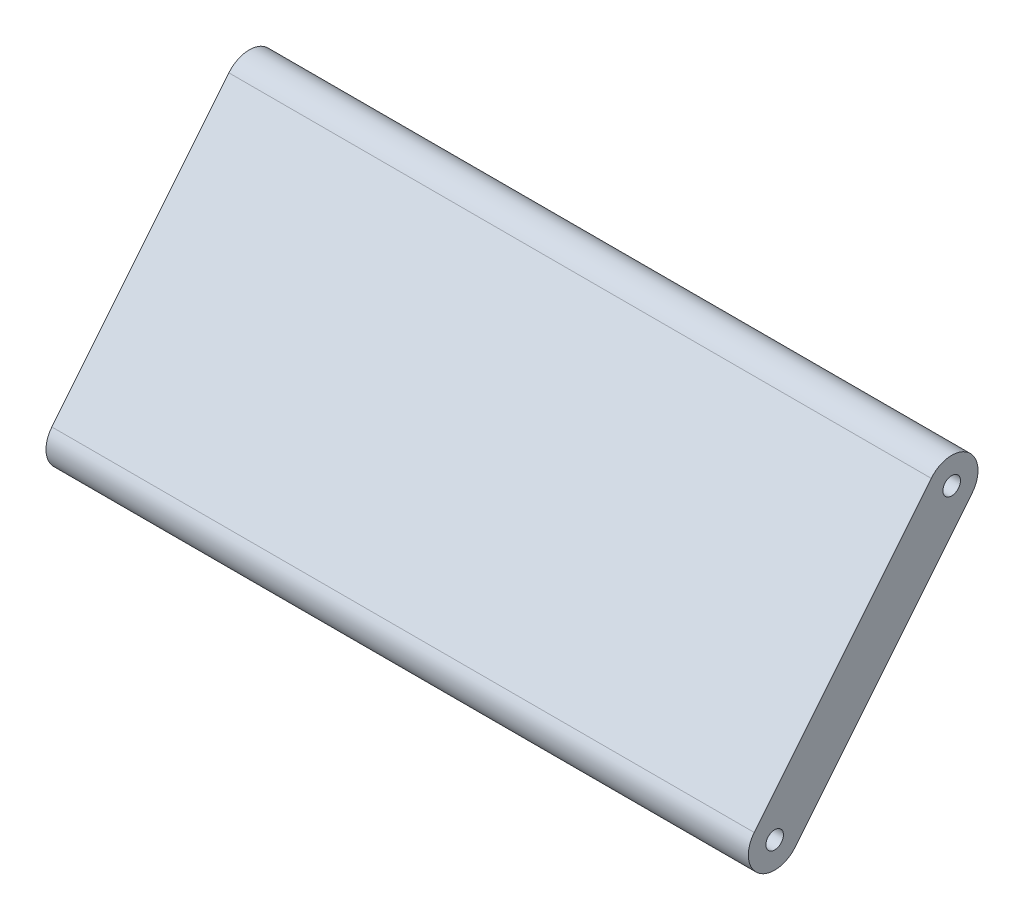
ISO-10303-21;
HEADER;
FILE_DESCRIPTION(('STEP AP214'),'2;1');
FILE_NAME('part.step','',(''),(''),'','','');
FILE_SCHEMA(('AUTOMOTIVE_DESIGN { 1 0 10303 214 1 1 1 1 }'));
ENDSEC;
DATA;
#1=APPLICATION_CONTEXT('core data for automotive mechanical design processes');
#2=APPLICATION_PROTOCOL_DEFINITION('international standard','automotive_design',2000,#1);
#3=PRODUCT_CONTEXT('',#1,'mechanical');
#4=PRODUCT('Part','Part','',(#3));
#5=PRODUCT_RELATED_PRODUCT_CATEGORY('part','',(#4));
#6=PRODUCT_DEFINITION_FORMATION('','',#4);
#7=PRODUCT_DEFINITION_CONTEXT('part definition',#1,'design');
#8=PRODUCT_DEFINITION('design','',#6,#7);
#9=PRODUCT_DEFINITION_SHAPE('','',#8);
#10=(LENGTH_UNIT() NAMED_UNIT(*) SI_UNIT(.MILLI.,.METRE.));
#11=(NAMED_UNIT(*) PLANE_ANGLE_UNIT() SI_UNIT($,.RADIAN.));
#12=(NAMED_UNIT(*) SI_UNIT($,.STERADIAN.) SOLID_ANGLE_UNIT());
#13=UNCERTAINTY_MEASURE_WITH_UNIT(LENGTH_MEASURE(1.E-05),#10,'distance_accuracy_value','');
#14=(GEOMETRIC_REPRESENTATION_CONTEXT(3) GLOBAL_UNCERTAINTY_ASSIGNED_CONTEXT((#13)) GLOBAL_UNIT_ASSIGNED_CONTEXT((#10,
#11,#12)) REPRESENTATION_CONTEXT('',''));
#15=CARTESIAN_POINT('',(0.,0.,0.));
#16=DIRECTION('',(0.,0.,1.));
#17=DIRECTION('',(1.,0.,0.));
#18=AXIS2_PLACEMENT_3D('',#15,#16,#17);
#19=CARTESIAN_POINT('',(10.,-4.94746405195682,13.6231964941302));
#20=DIRECTION('',(1.,0.,0.));
#21=DIRECTION('',(0.,0.,-1.));
#22=AXIS2_PLACEMENT_3D('',#19,#20,#21);
#23=PLANE('',#22);
#24=CARTESIAN_POINT('',(10.,-1.84126378101477,11.1029743061477));
#25=DIRECTION('',(1.,0.,0.));
#26=DIRECTION('',(0.,0.,-1.));
#27=AXIS2_PLACEMENT_3D('',#24,#25,#26);
#28=CIRCLE('',#27,0.125);
#29=CARTESIAN_POINT('',(10.,-1.84126378101477,10.9779743061477));
#30=VERTEX_POINT('',#29);
#31=EDGE_CURVE('E100',#30,#30,#28,.T.);
#32=ORIENTED_EDGE('',*,*,#31,.F.);
#33=EDGE_LOOP('',(#32));
#34=FACE_BOUND('',#33,.T.);
#35=CARTESIAN_POINT('',(10.,-4.94746405195682,13.6231964941302));
#36=DIRECTION('',(1.,0.,0.));
#37=DIRECTION('',(0.,0.,-1.));
#38=AXIS2_PLACEMENT_3D('',#35,#36,#37);
#39=CIRCLE('',#38,0.375000000000002);
#40=CARTESIAN_POINT('',(10.,-4.71119322183346,13.9144027695311));
#41=VERTEX_POINT('',#40);
#42=CARTESIAN_POINT('',(10.,-5.18373488208019,13.3319902187294));
#43=VERTEX_POINT('',#42);
#44=EDGE_CURVE('E85',#41,#43,#39,.T.);
#45=ORIENTED_EDGE('',*,*,#44,.T.);
#46=DIRECTION('',(0.,0.776550067735513,-0.630055546995636));
#47=VECTOR('',#46,1.);
#48=CARTESIAN_POINT('',(10.,-5.18373488208019,13.3319902187294));
#49=LINE('',#48,#47);
#50=CARTESIAN_POINT('',(10.,-2.07753461113813,10.8117680307469));
#51=VERTEX_POINT('',#50);
#52=EDGE_CURVE('E80',#43,#51,#49,.T.);
#53=ORIENTED_EDGE('',*,*,#52,.T.);
#54=CARTESIAN_POINT('',(10.,-1.84126378101477,11.1029743061477));
#55=DIRECTION('',(1.,0.,0.));
#56=DIRECTION('',(0.,0.,-1.));
#57=AXIS2_PLACEMENT_3D('',#54,#55,#56);
#58=CIRCLE('',#57,0.375000000000004);
#59=CARTESIAN_POINT('',(10.,-1.6049929508914,11.3941805815485));
#60=VERTEX_POINT('',#59);
#61=EDGE_CURVE('E83',#51,#60,#58,.T.);
#62=ORIENTED_EDGE('',*,*,#61,.T.);
#63=DIRECTION('',(0.,-0.776550067735514,0.630055546995635));
#64=VECTOR('',#63,1.);
#65=CARTESIAN_POINT('',(10.,-4.71119322183346,13.9144027695311));
#66=LINE('',#65,#64);
#67=EDGE_CURVE('E50',#60,#41,#66,.T.);
#68=ORIENTED_EDGE('',*,*,#67,.T.);
#69=EDGE_LOOP('',(#45,#53,#62,#68));
#70=FACE_BOUND('',#69,.T.);
#71=CARTESIAN_POINT('',(10.,-4.94746405195682,13.6231964941302));
#72=DIRECTION('',(1.,0.,0.));
#73=DIRECTION('',(0.,0.,-1.));
#74=AXIS2_PLACEMENT_3D('',#71,#72,#73);
#75=CIRCLE('',#74,0.125);
#76=CARTESIAN_POINT('',(10.,-4.94746405195682,13.4981964941302));
#77=VERTEX_POINT('',#76);
#78=EDGE_CURVE('E115',#77,#77,#75,.T.);
#79=ORIENTED_EDGE('',*,*,#78,.F.);
#80=EDGE_LOOP('',(#79));
#81=FACE_BOUND('',#80,.T.);
#82=ADVANCED_FACE('F33',(#34,#70,#81),#23,.T.);
#83=CARTESIAN_POINT('',(0.,-4.94746405195682,13.6231964941302));
#84=DIRECTION('',(1.,0.,0.));
#85=DIRECTION('',(0.,0.,-1.));
#86=AXIS2_PLACEMENT_3D('',#83,#84,#85);
#87=PLANE('',#86);
#88=CARTESIAN_POINT('',(0.,-4.94746405195682,13.6231964941302));
#89=DIRECTION('',(1.,0.,0.));
#90=DIRECTION('',(0.,0.,-1.));
#91=AXIS2_PLACEMENT_3D('',#88,#89,#90);
#92=CIRCLE('',#91,0.375000000000002);
#93=CARTESIAN_POINT('',(0.,-4.71119322183346,13.9144027695311));
#94=VERTEX_POINT('',#93);
#95=CARTESIAN_POINT('',(0.,-5.18373488208019,13.3319902187294));
#96=VERTEX_POINT('',#95);
#97=EDGE_CURVE('E97',#94,#96,#92,.T.);
#98=ORIENTED_EDGE('',*,*,#97,.F.);
#99=DIRECTION('',(0.,-0.776550067735514,0.630055546995635));
#100=VECTOR('',#99,1.);
#101=CARTESIAN_POINT('',(0.,-4.71119322183346,13.9144027695311));
#102=LINE('',#101,#100);
#103=CARTESIAN_POINT('',(0.,-1.6049929508914,11.3941805815485));
#104=VERTEX_POINT('',#103);
#105=EDGE_CURVE('E73',#104,#94,#102,.T.);
#106=ORIENTED_EDGE('',*,*,#105,.F.);
#107=CARTESIAN_POINT('',(0.,-1.84126378101477,11.1029743061477));
#108=DIRECTION('',(1.,0.,0.));
#109=DIRECTION('',(0.,0.,-1.));
#110=AXIS2_PLACEMENT_3D('',#107,#108,#109);
#111=CIRCLE('',#110,0.375000000000004);
#112=CARTESIAN_POINT('',(0.,-2.07753461113813,10.8117680307469));
#113=VERTEX_POINT('',#112);
#114=EDGE_CURVE('E67',#113,#104,#111,.T.);
#115=ORIENTED_EDGE('',*,*,#114,.F.);
#116=DIRECTION('',(0.,0.776550067735513,-0.630055546995636));
#117=VECTOR('',#116,1.);
#118=CARTESIAN_POINT('',(0.,-5.18373488208019,13.3319902187294));
#119=LINE('',#118,#117);
#120=EDGE_CURVE('E89',#96,#113,#119,.T.);
#121=ORIENTED_EDGE('',*,*,#120,.F.);
#122=EDGE_LOOP('',(#98,#106,#115,#121));
#123=FACE_BOUND('',#122,.T.);
#124=CARTESIAN_POINT('',(0.,-1.84126378101477,11.1029743061477));
#125=DIRECTION('',(1.,0.,0.));
#126=DIRECTION('',(0.,0.,-1.));
#127=AXIS2_PLACEMENT_3D('',#124,#125,#126);
#128=CIRCLE('',#127,0.125);
#129=CARTESIAN_POINT('',(0.,-1.84126378101477,10.9779743061477));
#130=VERTEX_POINT('',#129);
#131=EDGE_CURVE('E112',#130,#130,#128,.T.);
#132=ORIENTED_EDGE('',*,*,#131,.T.);
#133=EDGE_LOOP('',(#132));
#134=FACE_BOUND('',#133,.T.);
#135=CARTESIAN_POINT('',(0.,-4.94746405195682,13.6231964941302));
#136=DIRECTION('',(1.,0.,0.));
#137=DIRECTION('',(0.,0.,-1.));
#138=AXIS2_PLACEMENT_3D('',#135,#136,#137);
#139=CIRCLE('',#138,0.125);
#140=CARTESIAN_POINT('',(0.,-4.94746405195682,13.4981964941302));
#141=VERTEX_POINT('',#140);
#142=EDGE_CURVE('E118',#141,#141,#139,.T.);
#143=ORIENTED_EDGE('',*,*,#142,.T.);
#144=EDGE_LOOP('',(#143));
#145=FACE_BOUND('',#144,.T.);
#146=ADVANCED_FACE('F108',(#123,#134,#145),#87,.F.);
#147=CARTESIAN_POINT('',(10.,-4.94746405195682,13.6231964941302));
#148=DIRECTION('',(-1.,0.,0.));
#149=DIRECTION('',(0.,0.,1.));
#150=AXIS2_PLACEMENT_3D('',#147,#148,#149);
#151=CYLINDRICAL_SURFACE('',#150,0.375000000000002);
#152=ORIENTED_EDGE('',*,*,#97,.T.);
#153=DIRECTION('',(-1.,0.,0.));
#154=VECTOR('',#153,1.);
#155=CARTESIAN_POINT('',(10.,-5.18373488208019,13.3319902187294));
#156=LINE('',#155,#154);
#157=EDGE_CURVE('E11',#43,#96,#156,.T.);
#158=ORIENTED_EDGE('',*,*,#157,.F.);
#159=ORIENTED_EDGE('',*,*,#44,.F.);
#160=DIRECTION('',(-1.,0.,0.));
#161=VECTOR('',#160,1.);
#162=CARTESIAN_POINT('',(10.,-4.71119322183346,13.9144027695311));
#163=LINE('',#162,#161);
#164=EDGE_CURVE('E93',#41,#94,#163,.T.);
#165=ORIENTED_EDGE('',*,*,#164,.T.);
#166=EDGE_LOOP('',(#152,#158,#159,#165));
#167=FACE_BOUND('',#166,.T.);
#168=ADVANCED_FACE('F35',(#167),#151,.T.);
#169=CARTESIAN_POINT('',(10.,-5.18373488208019,13.3319902187294));
#170=DIRECTION('',(0.,0.630055546995636,0.776550067735513));
#171=DIRECTION('',(0.,-0.776550067735513,0.630055546995636));
#172=AXIS2_PLACEMENT_3D('',#169,#170,#171);
#173=PLANE('',#172);
#174=ORIENTED_EDGE('',*,*,#120,.T.);
#175=DIRECTION('',(-1.,0.,0.));
#176=VECTOR('',#175,1.);
#177=CARTESIAN_POINT('',(10.,-2.07753461113813,10.8117680307469));
#178=LINE('',#177,#176);
#179=EDGE_CURVE('E42',#51,#113,#178,.T.);
#180=ORIENTED_EDGE('',*,*,#179,.F.);
#181=ORIENTED_EDGE('',*,*,#52,.F.);
#182=ORIENTED_EDGE('',*,*,#157,.T.);
#183=EDGE_LOOP('',(#174,#180,#181,#182));
#184=FACE_BOUND('',#183,.T.);
#185=ADVANCED_FACE('F88',(#184),#173,.F.);
#186=CARTESIAN_POINT('',(10.,-1.84126378101477,11.1029743061477));
#187=DIRECTION('',(-1.,0.,0.));
#188=DIRECTION('',(0.,0.,1.));
#189=AXIS2_PLACEMENT_3D('',#186,#187,#188);
#190=CYLINDRICAL_SURFACE('',#189,0.375000000000004);
#191=ORIENTED_EDGE('',*,*,#114,.T.);
#192=DIRECTION('',(-1.,0.,0.));
#193=VECTOR('',#192,1.);
#194=CARTESIAN_POINT('',(10.,-1.6049929508914,11.3941805815485));
#195=LINE('',#194,#193);
#196=EDGE_CURVE('E90',#60,#104,#195,.T.);
#197=ORIENTED_EDGE('',*,*,#196,.F.);
#198=ORIENTED_EDGE('',*,*,#61,.F.);
#199=ORIENTED_EDGE('',*,*,#179,.T.);
#200=EDGE_LOOP('',(#191,#197,#198,#199));
#201=FACE_BOUND('',#200,.T.);
#202=ADVANCED_FACE('F91',(#201),#190,.T.);
#203=CARTESIAN_POINT('',(10.,-4.71119322183346,13.9144027695311));
#204=DIRECTION('',(0.,-0.630055546995635,-0.776550067735514));
#205=DIRECTION('',(0.,0.776550067735514,-0.630055546995635));
#206=AXIS2_PLACEMENT_3D('',#203,#204,#205);
#207=PLANE('',#206);
#208=ORIENTED_EDGE('',*,*,#105,.T.);
#209=ORIENTED_EDGE('',*,*,#164,.F.);
#210=ORIENTED_EDGE('',*,*,#67,.F.);
#211=ORIENTED_EDGE('',*,*,#196,.T.);
#212=EDGE_LOOP('',(#208,#209,#210,#211));
#213=FACE_BOUND('',#212,.T.);
#214=ADVANCED_FACE('F105',(#213),#207,.F.);
#215=CARTESIAN_POINT('',(10.,-1.84126378101477,11.1029743061477));
#216=DIRECTION('',(-1.,0.,0.));
#217=DIRECTION('',(0.,0.,1.));
#218=AXIS2_PLACEMENT_3D('',#215,#216,#217);
#219=CYLINDRICAL_SURFACE('',#218,0.125);
#220=ORIENTED_EDGE('',*,*,#31,.T.);
#221=EDGE_LOOP('',(#220));
#222=FACE_BOUND('',#221,.T.);
#223=ORIENTED_EDGE('',*,*,#131,.F.);
#224=EDGE_LOOP('',(#223));
#225=FACE_BOUND('',#224,.T.);
#226=ADVANCED_FACE('F135',(#222,#225),#219,.F.);
#227=CARTESIAN_POINT('',(10.,-4.94746405195682,13.6231964941302));
#228=DIRECTION('',(-1.,0.,0.));
#229=DIRECTION('',(0.,0.,1.));
#230=AXIS2_PLACEMENT_3D('',#227,#228,#229);
#231=CYLINDRICAL_SURFACE('',#230,0.125);
#232=ORIENTED_EDGE('',*,*,#78,.T.);
#233=EDGE_LOOP('',(#232));
#234=FACE_BOUND('',#233,.T.);
#235=ORIENTED_EDGE('',*,*,#142,.F.);
#236=EDGE_LOOP('',(#235));
#237=FACE_BOUND('',#236,.T.);
#238=ADVANCED_FACE('F124',(#234,#237),#231,.F.);
#239=CLOSED_SHELL('',(#82,#146,#168,#185,#202,#214,#226,#238));
#240=MANIFOLD_SOLID_BREP('B2',#239);
#241=ADVANCED_BREP_SHAPE_REPRESENTATION('',(#18,#240),#14);
#242=SHAPE_DEFINITION_REPRESENTATION(#9,#241);
ENDSEC;
END-ISO-10303-21;
